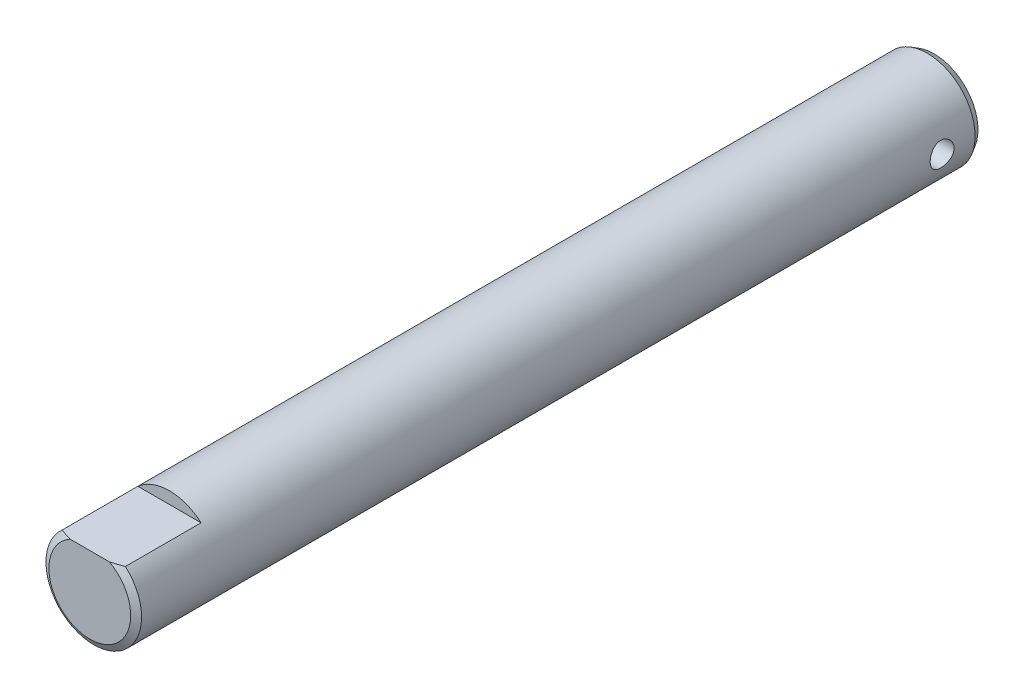
ISO-10303-21;
HEADER;
FILE_DESCRIPTION(('STEP AP214'),'2;1');
FILE_NAME('part.step','',(''),(''),'','','');
FILE_SCHEMA(('AUTOMOTIVE_DESIGN { 1 0 10303 214 1 1 1 1 }'));
ENDSEC;
DATA;
#1=APPLICATION_CONTEXT('core data for automotive mechanical design processes');
#2=APPLICATION_PROTOCOL_DEFINITION('international standard','automotive_design',2000,#1);
#3=PRODUCT_CONTEXT('',#1,'mechanical');
#4=PRODUCT('Part','Part','',(#3));
#5=PRODUCT_RELATED_PRODUCT_CATEGORY('part','',(#4));
#6=PRODUCT_DEFINITION_FORMATION('','',#4);
#7=PRODUCT_DEFINITION_CONTEXT('part definition',#1,'design');
#8=PRODUCT_DEFINITION('design','',#6,#7);
#9=PRODUCT_DEFINITION_SHAPE('','',#8);
#10=(LENGTH_UNIT() NAMED_UNIT(*) SI_UNIT(.MILLI.,.METRE.));
#11=(NAMED_UNIT(*) PLANE_ANGLE_UNIT() SI_UNIT($,.RADIAN.));
#12=(NAMED_UNIT(*) SI_UNIT($,.STERADIAN.) SOLID_ANGLE_UNIT());
#13=UNCERTAINTY_MEASURE_WITH_UNIT(LENGTH_MEASURE(1.E-05),#10,'distance_accuracy_value','');
#14=(GEOMETRIC_REPRESENTATION_CONTEXT(3) GLOBAL_UNCERTAINTY_ASSIGNED_CONTEXT((#13)) GLOBAL_UNIT_ASSIGNED_CONTEXT((#10,
#11,#12)) REPRESENTATION_CONTEXT('',''));
#15=CARTESIAN_POINT('',(0.,0.,0.));
#16=DIRECTION('',(0.,0.,1.));
#17=DIRECTION('',(1.,0.,0.));
#18=AXIS2_PLACEMENT_3D('',#15,#16,#17);
#19=CARTESIAN_POINT('',(0.,0.,106.));
#20=DIRECTION('',(0.,0.,-1.));
#21=DIRECTION('',(-1.,0.,0.));
#22=AXIS2_PLACEMENT_3D('',#19,#20,#21);
#23=CYLINDRICAL_SURFACE('',#22,6.);
#24=CARTESIAN_POINT('',(0.,0.,0.866025403784401));
#25=DIRECTION('',(0.,0.,1.));
#26=DIRECTION('',(1.,0.,0.));
#27=AXIS2_PLACEMENT_3D('',#24,#25,#26);
#28=CIRCLE('',#27,6.);
#29=CARTESIAN_POINT('',(6.,0.,0.866025403784401));
#30=VERTEX_POINT('',#29);
#31=EDGE_CURVE('E132',#30,#30,#28,.T.);
#32=ORIENTED_EDGE('',*,*,#31,.T.);
#33=EDGE_LOOP('',(#32));
#34=FACE_BOUND('',#33,.T.);
#35=CARTESIAN_POINT('',(-6.,0.,3.5));
#36=CARTESIAN_POINT('',(-5.99999859868013,0.0828760886697312,3.50000232573816));
#37=CARTESIAN_POINT('',(-5.99826578131828,0.165778157830763,3.50689155077379));
#38=CARTESIAN_POINT('',(-5.99152113829892,0.329206323770533,3.534225151307));
#39=CARTESIAN_POINT('',(-5.98650745419968,0.409731046870739,3.55467720953785));
#40=CARTESIAN_POINT('',(-5.9737562633204,0.566020872182577,3.60843925346209));
#41=CARTESIAN_POINT('',(-5.96602202842087,0.641791563430003,3.64173379871528));
#42=CARTESIAN_POINT('',(-5.94865343807593,0.786672131904427,3.72018139004483));
#43=CARTESIAN_POINT('',(-5.9390190185405,0.85578178434876,3.76533483611894));
#44=CARTESIAN_POINT('',(-5.91867413591801,0.98680192730092,3.86720078965421));
#45=CARTESIAN_POINT('',(-5.90794707148533,1.04855569006107,3.92411157495918));
#46=CARTESIAN_POINT('',(-5.8867362011753,1.1617489272033,4.04745220490892));
#47=CARTESIAN_POINT('',(-5.87625242288348,1.21318723694914,4.1138831229465));
#48=CARTESIAN_POINT('',(-5.8565477569971,1.30502654279903,4.25559522673744));
#49=CARTESIAN_POINT('',(-5.84734794470605,1.34525221592536,4.3309932308104));
#50=CARTESIAN_POINT('',(-5.83149494812223,1.41239690855053,4.48774841165836));
#51=CARTESIAN_POINT('',(-5.82484135672789,1.43931805543933,4.56910463332576));
#52=CARTESIAN_POINT('',(-5.81500476717551,1.47855483680429,4.73374349820248));
#53=CARTESIAN_POINT('',(-5.81175491075426,1.49115226833334,4.8169548960498));
#54=CARTESIAN_POINT('',(-5.80889362537741,1.50226177506785,4.98436856901398));
#55=CARTESIAN_POINT('',(-5.80928160448644,1.50077614181798,5.06857068069861));
#56=CARTESIAN_POINT('',(-5.81359205496618,1.48398652463928,5.23341580774448));
#57=CARTESIAN_POINT('',(-5.81742863001879,1.46901834019052,5.3140956214651));
#58=CARTESIAN_POINT('',(-5.82806709676484,1.42622418690311,5.47176105091129));
#59=CARTESIAN_POINT('',(-5.83486919970696,1.39839730206942,5.54874640302898));
#60=CARTESIAN_POINT('',(-5.85075113904187,1.33038947793715,5.69773801625207));
#61=CARTESIAN_POINT('',(-5.85985327469421,1.29008666723291,5.76968617178955));
#62=CARTESIAN_POINT('',(-5.87929710846386,1.19835627601496,5.90591870975684));
#63=CARTESIAN_POINT('',(-5.88963902334735,1.14692674880884,5.97020174806726));
#64=CARTESIAN_POINT('',(-5.91075880539781,1.03266342468122,6.0912036156944));
#65=CARTESIAN_POINT('',(-5.92154069477971,0.969546258165861,6.14765449006135));
#66=CARTESIAN_POINT('',(-5.94205965578786,0.834611917503701,6.24922124246391));
#67=CARTESIAN_POINT('',(-5.95179669549415,0.762794477707944,6.29433677426357));
#68=CARTESIAN_POINT('',(-5.96917732094183,0.612115888681392,6.37205058622439));
#69=CARTESIAN_POINT('',(-5.97681360127725,0.533231393208624,6.40460534025443));
#70=CARTESIAN_POINT('',(-5.98907916991419,0.370876008142884,6.45591730570957));
#71=CARTESIAN_POINT('',(-5.99370903339281,0.287405999150485,6.47467715641814));
#72=CARTESIAN_POINT('',(-5.99935499271375,0.120539970390027,6.49745756555884));
#73=CARTESIAN_POINT('',(-6.00046053508279,0.0371967199882102,6.5018430260753));
#74=CARTESIAN_POINT('',(-5.99918804814451,-0.129032874801508,6.49675099794452));
#75=CARTESIAN_POINT('',(-5.99681033241847,-0.211919259644595,6.48727475720087));
#76=CARTESIAN_POINT('',(-5.98889581127357,-0.373614268776492,6.45502909160862));
#77=CARTESIAN_POINT('',(-5.98340634185811,-0.452465118968754,6.43245873652301));
#78=CARTESIAN_POINT('',(-5.96988706634134,-0.605257292452511,6.37489291597156));
#79=CARTESIAN_POINT('',(-5.96185700369892,-0.679198119032634,6.33989619568683));
#80=CARTESIAN_POINT('',(-5.9439330792631,-0.821523134429847,6.25776387112527));
#81=CARTESIAN_POINT('',(-5.93400867366932,-0.88978544183583,6.21042388760324));
#82=CARTESIAN_POINT('',(-5.91344509187419,-1.01752661364325,6.10521009120303));
#83=CARTESIAN_POINT('',(-5.90280579251705,-1.07700395897301,6.04733446038309));
#84=CARTESIAN_POINT('',(-5.88168956960771,-1.18699056807273,5.92099803915554));
#85=CARTESIAN_POINT('',(-5.87122304187281,-1.23724386762203,5.85231229699758));
#86=CARTESIAN_POINT('',(-5.85192878377239,-1.3255107590127,5.70726736553428));
#87=CARTESIAN_POINT('',(-5.84310098067026,-1.36352489415794,5.63090851704025));
#88=CARTESIAN_POINT('',(-5.82818094734665,-1.42595142060929,5.47309427758692));
#89=CARTESIAN_POINT('',(-5.82207255291906,-1.45044439665407,5.39167237165599));
#90=CARTESIAN_POINT('',(-5.81326744090184,-1.48534565995378,5.22569036211089));
#91=CARTESIAN_POINT('',(-5.81056997719936,-1.49575702747866,5.14113094896751));
#92=CARTESIAN_POINT('',(-5.80894901203957,-1.50203859033399,4.9738789761448));
#93=CARTESIAN_POINT('',(-5.80991932728264,-1.49831789778012,4.89120256487527));
#94=CARTESIAN_POINT('',(-5.81527909007843,-1.47737727831287,4.72769611133202));
#95=CARTESIAN_POINT('',(-5.81966846891857,-1.46015762268677,4.64686603198635));
#96=CARTESIAN_POINT('',(-5.83131260682722,-1.41293131944279,4.48979154093459));
#97=CARTESIAN_POINT('',(-5.83855015236309,-1.38300140468038,4.41352269475979));
#98=CARTESIAN_POINT('',(-5.85507755724829,-1.31126491360507,4.26703461728631));
#99=CARTESIAN_POINT('',(-5.86436770120773,-1.26945669003419,4.19681622681309));
#100=CARTESIAN_POINT('',(-5.88425634263512,-1.17386774863714,4.06244537099798));
#101=CARTESIAN_POINT('',(-5.89488264831757,-1.11980316291226,3.99849892657604));
#102=CARTESIAN_POINT('',(-5.91608027246286,-1.00178937118974,3.88045295520459));
#103=CARTESIAN_POINT('',(-5.9266515772706,-0.937837821261146,3.82635576988703));
#104=CARTESIAN_POINT('',(-5.94677655647663,-0.800467586702591,3.72858869143539));
#105=CARTESIAN_POINT('',(-5.95630833365868,-0.726898422316387,3.68512538632842));
#106=CARTESIAN_POINT('',(-5.97304924975118,-0.573266059510477,3.61125253705947));
#107=CARTESIAN_POINT('',(-5.98026005199781,-0.49320756343674,3.58083363935146));
#108=CARTESIAN_POINT('',(-5.99048059565542,-0.344410253243473,3.53842816967035));
#109=CARTESIAN_POINT('',(-5.99402585052691,-0.27638017090807,3.52404875694657));
#110=CARTESIAN_POINT('',(-5.99878605231948,-0.138906071536284,3.50483405637806));
#111=CARTESIAN_POINT('',(-6.00000117450894,-0.0694621612426168,3.4999980506947));
#112=CARTESIAN_POINT('',(-6.,0.,3.5));
#113=B_SPLINE_CURVE_WITH_KNOTS('',3,(#35,#36,#37,#38,#39,#40,#41,#42,#43,#44,#45,#46,#47,#48,
#49,#50,#51,#52,#53,#54,#55,#56,#57,#58,#59,#60,#61,#62,#63,#64,#65,#66,#67,#68,#69,#70,#71,#72,
#73,#74,#75,#76,#77,#78,#79,#80,#81,#82,#83,#84,#85,#86,#87,#88,#89,#90,#91,#92,#93,#94,#95,#96,
#97,#98,#99,#100,#101,#102,#103,#104,#105,#106,#107,#108,#109,#110,#111,#112),.UNSPECIFIED.,.T.,
.F.,(4,2,2,2,2,2,2,2,2,2,2,2,2,2,2,2,2,2,2,2,2,2,2,2,2,2,2,2,2,2,2,2,2,2,2,2,2,2,4),(0.,
0.24837371247189,0.4968882377639,0.745104902286106,0.993329940169328,1.24614435437139,
1.49898729580062,1.75558647545807,2.01214461169368,2.2635629509943,2.51494038112697,
2.76022497007018,3.00552703466038,3.25330527873879,3.50112690836163,3.75601500969019,
4.01091089558247,4.26668229009114,4.52240473688643,4.77158308949276,5.02073901112743,
5.26620274514038,5.51169127322291,5.76153587565352,6.01142363008019,6.26744509204476,
6.52345518749508,6.77792254614037,7.03233423252408,7.27943780398613,7.52653640956035,
7.77216400559448,8.01782568136902,8.26989576409911,8.52202569770418,8.77872185499588,
9.03523363821351,9.24342242942149,9.4515955604304),.UNSPECIFIED.);
#114=CARTESIAN_POINT('',(-6.,0.,3.5));
#115=VERTEX_POINT('',#114);
#116=EDGE_CURVE('E98',#115,#115,#113,.T.);
#117=ORIENTED_EDGE('',*,*,#116,.T.);
#118=EDGE_LOOP('',(#117));
#119=FACE_BOUND('',#118,.T.);
#120=CARTESIAN_POINT('',(6.,0.,3.5));
#121=CARTESIAN_POINT('',(5.99999859868012,-0.0828760886697312,3.50000232573816));
#122=CARTESIAN_POINT('',(5.99826578131828,-0.165778157830763,3.50689155077379));
#123=CARTESIAN_POINT('',(5.99152113829892,-0.329206323770533,3.534225151307));
#124=CARTESIAN_POINT('',(5.98650745419968,-0.409731046870739,3.55467720953785));
#125=CARTESIAN_POINT('',(5.9737562633204,-0.566020872182577,3.60843925346209));
#126=CARTESIAN_POINT('',(5.96602202842087,-0.641791563430004,3.64173379871528));
#127=CARTESIAN_POINT('',(5.94865343807593,-0.786672131904427,3.72018139004483));
#128=CARTESIAN_POINT('',(5.9390190185405,-0.85578178434876,3.76533483611894));
#129=CARTESIAN_POINT('',(5.91867413591801,-0.98680192730092,3.86720078965421));
#130=CARTESIAN_POINT('',(5.90794707148533,-1.04855569006107,3.92411157495918));
#131=CARTESIAN_POINT('',(5.8867362011753,-1.16174892720331,4.04745220490892));
#132=CARTESIAN_POINT('',(5.87625242288348,-1.21318723694914,4.1138831229465));
#133=CARTESIAN_POINT('',(5.8565477569971,-1.30502654279903,4.25559522673744));
#134=CARTESIAN_POINT('',(5.84734794470605,-1.34525221592536,4.3309932308104));
#135=CARTESIAN_POINT('',(5.83149494812223,-1.41239690855053,4.48774841165836));
#136=CARTESIAN_POINT('',(5.82484135672789,-1.43931805543933,4.56910463332576));
#137=CARTESIAN_POINT('',(5.81500476717551,-1.47855483680429,4.73374349820248));
#138=CARTESIAN_POINT('',(5.81175491075426,-1.49115226833334,4.8169548960498));
#139=CARTESIAN_POINT('',(5.80889362537741,-1.50226177506785,4.98436856901398));
#140=CARTESIAN_POINT('',(5.80928160448644,-1.50077614181798,5.06857068069861));
#141=CARTESIAN_POINT('',(5.81359205496618,-1.48398652463928,5.23341580774448));
#142=CARTESIAN_POINT('',(5.81742863001879,-1.46901834019052,5.3140956214651));
#143=CARTESIAN_POINT('',(5.82806709676484,-1.42622418690311,5.47176105091129));
#144=CARTESIAN_POINT('',(5.83486919970696,-1.39839730206942,5.54874640302898));
#145=CARTESIAN_POINT('',(5.85075113904187,-1.33038947793715,5.69773801625207));
#146=CARTESIAN_POINT('',(5.85985327469421,-1.29008666723291,5.76968617178955));
#147=CARTESIAN_POINT('',(5.87929710846386,-1.19835627601496,5.90591870975684));
#148=CARTESIAN_POINT('',(5.88963902334735,-1.14692674880884,5.97020174806726));
#149=CARTESIAN_POINT('',(5.91075880539781,-1.03266342468122,6.0912036156944));
#150=CARTESIAN_POINT('',(5.92154069477971,-0.969546258165861,6.14765449006135));
#151=CARTESIAN_POINT('',(5.94205965578786,-0.834611917503701,6.24922124246391));
#152=CARTESIAN_POINT('',(5.95179669549415,-0.762794477707945,6.29433677426357));
#153=CARTESIAN_POINT('',(5.96917732094183,-0.612115888681392,6.37205058622439));
#154=CARTESIAN_POINT('',(5.97681360127725,-0.533231393208624,6.40460534025443));
#155=CARTESIAN_POINT('',(5.98907916991419,-0.370876008142883,6.45591730570957));
#156=CARTESIAN_POINT('',(5.99370903339281,-0.287405999150485,6.47467715641814));
#157=CARTESIAN_POINT('',(5.99935499271375,-0.120539970390027,6.49745756555884));
#158=CARTESIAN_POINT('',(6.00046053508279,-0.0371967199882101,6.5018430260753));
#159=CARTESIAN_POINT('',(5.99918804814451,0.129032874801508,6.49675099794452));
#160=CARTESIAN_POINT('',(5.99681033241847,0.211919259644595,6.48727475720087));
#161=CARTESIAN_POINT('',(5.98889581127357,0.373614268776492,6.45502909160862));
#162=CARTESIAN_POINT('',(5.98340634185811,0.452465118968755,6.43245873652301));
#163=CARTESIAN_POINT('',(5.96988706634134,0.605257292452512,6.37489291597155));
#164=CARTESIAN_POINT('',(5.96185700369892,0.679198119032635,6.33989619568683));
#165=CARTESIAN_POINT('',(5.94393307926311,0.821523134429848,6.25776387112527));
#166=CARTESIAN_POINT('',(5.93400867366932,0.889785441835831,6.21042388760324));
#167=CARTESIAN_POINT('',(5.91344509187419,1.01752661364325,6.10521009120303));
#168=CARTESIAN_POINT('',(5.90280579251705,1.07700395897301,6.04733446038309));
#169=CARTESIAN_POINT('',(5.88168956960771,1.18699056807273,5.92099803915554));
#170=CARTESIAN_POINT('',(5.87122304187281,1.23724386762203,5.85231229699758));
#171=CARTESIAN_POINT('',(5.85192878377239,1.3255107590127,5.70726736553428));
#172=CARTESIAN_POINT('',(5.84310098067026,1.36352489415794,5.63090851704025));
#173=CARTESIAN_POINT('',(5.82818094734665,1.42595142060929,5.47309427758692));
#174=CARTESIAN_POINT('',(5.82207255291906,1.45044439665407,5.39167237165599));
#175=CARTESIAN_POINT('',(5.81326744090184,1.48534565995378,5.22569036211089));
#176=CARTESIAN_POINT('',(5.81056997719936,1.49575702747866,5.14113094896751));
#177=CARTESIAN_POINT('',(5.80894901203957,1.50203859033399,4.9738789761448));
#178=CARTESIAN_POINT('',(5.80991932728264,1.49831789778012,4.89120256487527));
#179=CARTESIAN_POINT('',(5.81527909007843,1.47737727831287,4.72769611133202));
#180=CARTESIAN_POINT('',(5.81966846891857,1.46015762268677,4.64686603198635));
#181=CARTESIAN_POINT('',(5.83131260682722,1.41293131944279,4.48979154093459));
#182=CARTESIAN_POINT('',(5.83855015236309,1.38300140468038,4.41352269475979));
#183=CARTESIAN_POINT('',(5.85507755724829,1.31126491360507,4.26703461728631));
#184=CARTESIAN_POINT('',(5.86436770120773,1.26945669003419,4.19681622681309));
#185=CARTESIAN_POINT('',(5.88425634263512,1.17386774863714,4.06244537099798));
#186=CARTESIAN_POINT('',(5.89488264831757,1.11980316291226,3.99849892657604));
#187=CARTESIAN_POINT('',(5.91608027246286,1.00178937118974,3.88045295520459));
#188=CARTESIAN_POINT('',(5.9266515772706,0.937837821261146,3.82635576988703));
#189=CARTESIAN_POINT('',(5.94677655647663,0.800467586702591,3.72858869143539));
#190=CARTESIAN_POINT('',(5.95630833365868,0.726898422316387,3.68512538632842));
#191=CARTESIAN_POINT('',(5.97304924975118,0.573266059510477,3.61125253705947));
#192=CARTESIAN_POINT('',(5.98026005199781,0.49320756343674,3.58083363935146));
#193=CARTESIAN_POINT('',(5.99048059565542,0.344410253243472,3.53842816967035));
#194=CARTESIAN_POINT('',(5.99402585052691,0.276380170908069,3.52404875694657));
#195=CARTESIAN_POINT('',(5.99878605231948,0.138906071536284,3.50483405637806));
#196=CARTESIAN_POINT('',(6.00000117450894,0.0694621612426165,3.4999980506947));
#197=CARTESIAN_POINT('',(6.,0.,3.5));
#198=B_SPLINE_CURVE_WITH_KNOTS('',3,(#120,#121,#122,#123,#124,#125,#126,#127,#128,#129,#130,
#131,#132,#133,#134,#135,#136,#137,#138,#139,#140,#141,#142,#143,#144,#145,#146,#147,#148,#149,
#150,#151,#152,#153,#154,#155,#156,#157,#158,#159,#160,#161,#162,#163,#164,#165,#166,#167,#168,
#169,#170,#171,#172,#173,#174,#175,#176,#177,#178,#179,#180,#181,#182,#183,#184,#185,#186,#187,
#188,#189,#190,#191,#192,#193,#194,#195,#196,#197),.UNSPECIFIED.,.T.,.F.,(4,2,2,2,2,2,2,2,2,2,2,
2,2,2,2,2,2,2,2,2,2,2,2,2,2,2,2,2,2,2,2,2,2,2,2,2,2,2,4),(0.,0.24837371247189,0.4968882377639,
0.745104902286106,0.993329940169329,1.24614435437139,1.49898729580062,1.75558647545807,
2.01214461169369,2.2635629509943,2.51494038112697,2.76022497007018,3.00552703466038,
3.25330527873879,3.50112690836163,3.75601500969019,4.01091089558247,4.26668229009114,
4.52240473688643,4.77158308949276,5.02073901112743,5.26620274514037,5.51169127322291,
5.76153587565352,6.01142363008019,6.26744509204476,6.52345518749508,6.77792254614037,
7.03233423252408,7.27943780398613,7.52653640956034,7.77216400559447,8.01782568136901,
8.2698957640991,8.52202569770418,8.77872185499588,9.0352336382135,9.24342242942149,
9.4515955604304),.UNSPECIFIED.);
#199=CARTESIAN_POINT('',(6.,0.,3.5));
#200=VERTEX_POINT('',#199);
#201=EDGE_CURVE('E84',#200,#200,#198,.T.);
#202=ORIENTED_EDGE('',*,*,#201,.T.);
#203=EDGE_LOOP('',(#202));
#204=FACE_BOUND('',#203,.T.);
#205=DIRECTION('',(0.,0.,-1.));
#206=VECTOR('',#205,1.);
#207=CARTESIAN_POINT('',(3.96862696659689,4.5,106.));
#208=LINE('',#207,#206);
#209=CARTESIAN_POINT('',(3.96862696659689,4.5,96.));
#210=VERTEX_POINT('',#209);
#211=CARTESIAN_POINT('',(3.96862696659689,4.5,105.5));
#212=VERTEX_POINT('',#211);
#213=EDGE_CURVE('E78',#210,#212,#208,.F.);
#214=ORIENTED_EDGE('',*,*,#213,.T.);
#215=CARTESIAN_POINT('',(0.,0.,105.5));
#216=DIRECTION('',(0.,0.,1.));
#217=DIRECTION('',(1.,0.,0.));
#218=AXIS2_PLACEMENT_3D('',#215,#216,#217);
#219=CIRCLE('',#218,6.);
#220=CARTESIAN_POINT('',(-3.96862696659689,4.5,105.5));
#221=VERTEX_POINT('',#220);
#222=EDGE_CURVE('E48',#212,#221,#219,.F.);
#223=ORIENTED_EDGE('',*,*,#222,.T.);
#224=DIRECTION('',(0.,0.,-1.));
#225=VECTOR('',#224,1.);
#226=CARTESIAN_POINT('',(-3.96862696659689,4.5,106.));
#227=LINE('',#226,#225);
#228=CARTESIAN_POINT('',(-3.96862696659689,4.5,96.));
#229=VERTEX_POINT('',#228);
#230=EDGE_CURVE('E72',#221,#229,#227,.T.);
#231=ORIENTED_EDGE('',*,*,#230,.T.);
#232=CARTESIAN_POINT('',(0.,0.,96.));
#233=DIRECTION('',(0.,0.,1.));
#234=DIRECTION('',(1.,0.,0.));
#235=AXIS2_PLACEMENT_3D('',#232,#233,#234);
#236=CIRCLE('',#235,6.);
#237=EDGE_CURVE('E74',#210,#229,#236,.T.);
#238=ORIENTED_EDGE('',*,*,#237,.F.);
#239=EDGE_LOOP('',(#214,#223,#231,#238));
#240=FACE_BOUND('',#239,.T.);
#241=ADVANCED_FACE('F39',(#34,#119,#204,#240),#23,.T.);
#242=CARTESIAN_POINT('',(0.,0.,106.));
#243=DIRECTION('',(0.,0.,1.));
#244=DIRECTION('',(1.,0.,0.));
#245=AXIS2_PLACEMENT_3D('',#242,#243,#244);
#246=PLANE('',#245);
#247=DIRECTION('',(1.,0.,0.));
#248=VECTOR('',#247,1.);
#249=CARTESIAN_POINT('',(0.,4.5,106.));
#250=LINE('',#249,#248);
#251=CARTESIAN_POINT('',(-2.47137515456208,4.5,106.));
#252=VERTEX_POINT('',#251);
#253=CARTESIAN_POINT('',(2.47137515456208,4.5,106.));
#254=VERTEX_POINT('',#253);
#255=EDGE_CURVE('E77',#252,#254,#250,.T.);
#256=ORIENTED_EDGE('',*,*,#255,.F.);
#257=CARTESIAN_POINT('',(0.,0.,106.));
#258=DIRECTION('',(0.,0.,1.));
#259=DIRECTION('',(1.,0.,0.));
#260=AXIS2_PLACEMENT_3D('',#257,#258,#259);
#261=CIRCLE('',#260,5.13397459621556);
#262=EDGE_CURVE('E158',#252,#254,#261,.T.);
#263=ORIENTED_EDGE('',*,*,#262,.T.);
#264=EDGE_LOOP('',(#256,#263));
#265=FACE_BOUND('',#264,.T.);
#266=ADVANCED_FACE('F118',(#265),#246,.T.);
#267=CARTESIAN_POINT('',(0.,0.,0.));
#268=DIRECTION('',(0.,0.,1.));
#269=DIRECTION('',(1.,0.,0.));
#270=AXIS2_PLACEMENT_3D('',#267,#268,#269);
#271=PLANE('',#270);
#272=CARTESIAN_POINT('',(0.,0.,0.));
#273=DIRECTION('',(0.,0.,1.));
#274=DIRECTION('',(1.,0.,0.));
#275=AXIS2_PLACEMENT_3D('',#272,#273,#274);
#276=CIRCLE('',#275,5.50000000000003);
#277=CARTESIAN_POINT('',(5.50000000000003,0.,0.));
#278=VERTEX_POINT('',#277);
#279=EDGE_CURVE('E11',#278,#278,#276,.F.);
#280=ORIENTED_EDGE('',*,*,#279,.T.);
#281=EDGE_LOOP('',(#280));
#282=FACE_BOUND('',#281,.T.);
#283=ADVANCED_FACE('F114',(#282),#271,.F.);
#284=CARTESIAN_POINT('',(0.,0.,96.));
#285=DIRECTION('',(0.,0.,1.));
#286=DIRECTION('',(1.,0.,0.));
#287=AXIS2_PLACEMENT_3D('',#284,#285,#286);
#288=PLANE('',#287);
#289=ORIENTED_EDGE('',*,*,#237,.T.);
#290=DIRECTION('',(1.,0.,0.));
#291=VECTOR('',#290,1.);
#292=CARTESIAN_POINT('',(-6.44874547961821,4.5,96.));
#293=LINE('',#292,#291);
#294=EDGE_CURVE('E83',#229,#210,#293,.T.);
#295=ORIENTED_EDGE('',*,*,#294,.T.);
#296=EDGE_LOOP('',(#289,#295));
#297=FACE_BOUND('',#296,.T.);
#298=ADVANCED_FACE('F82',(#297),#288,.T.);
#299=CARTESIAN_POINT('',(-6.44874547961821,4.5,96.));
#300=DIRECTION('',(0.,-1.,0.));
#301=DIRECTION('',(0.,0.,-1.));
#302=AXIS2_PLACEMENT_3D('',#299,#300,#301);
#303=PLANE('',#302);
#304=ORIENTED_EDGE('',*,*,#255,.T.);
#305=CARTESIAN_POINT('',(2.47137515456208,4.5,106.));
#306=CARTESIAN_POINT('',(2.59821029234091,4.5,105.964741067028));
#307=CARTESIAN_POINT('',(2.72449842776643,4.5,105.927566203446));
#308=CARTESIAN_POINT('',(2.97597185015973,4.5,105.849882020878));
#309=CARTESIAN_POINT('',(3.10115769990573,4.5,105.809374527543));
#310=CARTESIAN_POINT('',(3.35054029678143,4.5,105.725488234176));
#311=CARTESIAN_POINT('',(3.47473716361617,4.5,105.682109787745));
#312=CARTESIAN_POINT('',(3.72230196848673,4.5,105.592839293428));
#313=CARTESIAN_POINT('',(3.84566941885811,4.5,105.54694589105));
#314=CARTESIAN_POINT('',(3.96862696659689,4.5,105.5));
#315=B_SPLINE_CURVE_WITH_KNOTS('',3,(#305,#306,#307,#308,#309,#310,#311,#312,#313,#314),
.UNSPECIFIED.,.F.,.F.,(4,2,2,2,4),(0.,0.394899349737702,0.789583791657925,1.18421971236831,
1.57907030390004),.UNSPECIFIED.);
#316=EDGE_CURVE('E62',#254,#212,#315,.T.);
#317=ORIENTED_EDGE('',*,*,#316,.T.);
#318=ORIENTED_EDGE('',*,*,#213,.F.);
#319=ORIENTED_EDGE('',*,*,#294,.F.);
#320=ORIENTED_EDGE('',*,*,#230,.F.);
#321=CARTESIAN_POINT('',(-3.96862696659689,4.5,105.5));
#322=CARTESIAN_POINT('',(-3.84566941885811,4.5,105.54694589105));
#323=CARTESIAN_POINT('',(-3.72230196848673,4.5,105.592839293428));
#324=CARTESIAN_POINT('',(-3.47473716361617,4.5,105.682109787745));
#325=CARTESIAN_POINT('',(-3.35054029678143,4.5,105.725488234176));
#326=CARTESIAN_POINT('',(-3.10115769990573,4.5,105.809374527543));
#327=CARTESIAN_POINT('',(-2.97597185015973,4.5,105.849882020878));
#328=CARTESIAN_POINT('',(-2.72449842776643,4.5,105.927566203446));
#329=CARTESIAN_POINT('',(-2.59821029234091,4.5,105.964741067028));
#330=CARTESIAN_POINT('',(-2.47137515456208,4.5,106.));
#331=B_SPLINE_CURVE_WITH_KNOTS('',3,(#321,#322,#323,#324,#325,#326,#327,#328,#329,#330),
.UNSPECIFIED.,.F.,.F.,(4,2,2,2,4),(0.,0.394850591531729,0.789486512242111,1.18417095416234,
1.57907030390004),.UNSPECIFIED.);
#332=EDGE_CURVE('E121',#221,#252,#331,.T.);
#333=ORIENTED_EDGE('',*,*,#332,.T.);
#334=EDGE_LOOP('',(#304,#317,#318,#319,#320,#333));
#335=FACE_BOUND('',#334,.T.);
#336=ADVANCED_FACE('F86',(#335),#303,.F.);
#337=CARTESIAN_POINT('',(-6.,0.,5.));
#338=DIRECTION('',(1.,0.,0.));
#339=DIRECTION('',(0.,0.,-1.));
#340=AXIS2_PLACEMENT_3D('',#337,#338,#339);
#341=CYLINDRICAL_SURFACE('',#340,1.5);
#342=ORIENTED_EDGE('',*,*,#201,.F.);
#343=EDGE_LOOP('',(#342));
#344=FACE_BOUND('',#343,.T.);
#345=ORIENTED_EDGE('',*,*,#116,.F.);
#346=EDGE_LOOP('',(#345));
#347=FACE_BOUND('',#346,.T.);
#348=ADVANCED_FACE('F105',(#344,#347),#341,.F.);
#349=CARTESIAN_POINT('',(0.,0.,106.));
#350=DIRECTION('',(0.,0.,-1.));
#351=DIRECTION('',(-1.,0.,0.));
#352=AXIS2_PLACEMENT_3D('',#349,#350,#351);
#353=CONICAL_SURFACE('',#352,5.13397459621556,1.04719755119659);
#354=ORIENTED_EDGE('',*,*,#332,.F.);
#355=ORIENTED_EDGE('',*,*,#222,.F.);
#356=ORIENTED_EDGE('',*,*,#316,.F.);
#357=ORIENTED_EDGE('',*,*,#262,.F.);
#358=EDGE_LOOP('',(#354,#355,#356,#357));
#359=FACE_BOUND('',#358,.T.);
#360=ADVANCED_FACE('F109',(#359),#353,.T.);
#361=CARTESIAN_POINT('',(0.,0.,0.866025403784401));
#362=DIRECTION('',(0.,0.,1.));
#363=DIRECTION('',(1.,0.,0.));
#364=AXIS2_PLACEMENT_3D('',#361,#362,#363);
#365=CONICAL_SURFACE('',#364,6.,0.523598775598296);
#366=CARTESIAN_POINT('',(5.50000000000003,0.,0.));
#367=CARTESIAN_POINT('',(5.50520833333336,0.,0.00902109795608741));
#368=CARTESIAN_POINT('',(5.51041666666669,0.,0.0180421959121749));
#369=CARTESIAN_POINT('',(5.52083333333336,0.,0.0360843918243499));
#370=CARTESIAN_POINT('',(5.52604166666669,0.,0.0451054897804374));
#371=CARTESIAN_POINT('',(5.53645833333336,0.,0.0631476856926125));
#372=CARTESIAN_POINT('',(5.54166666666669,0.,0.0721687836487));
#373=CARTESIAN_POINT('',(5.55208333333336,0.,0.090210979560875));
#374=CARTESIAN_POINT('',(5.55729166666669,0.,0.0992320775169625));
#375=CARTESIAN_POINT('',(5.56770833333336,0.,0.117274273429138));
#376=CARTESIAN_POINT('',(5.57291666666669,0.,0.126295371385225));
#377=CARTESIAN_POINT('',(5.58333333333335,0.,0.1443375672974));
#378=CARTESIAN_POINT('',(5.58854166666669,0.,0.153358665253488));
#379=CARTESIAN_POINT('',(5.59895833333335,0.,0.171400861165663));
#380=CARTESIAN_POINT('',(5.60416666666669,0.,0.18042195912175));
#381=CARTESIAN_POINT('',(5.61458333333335,0.,0.198464155033925));
#382=CARTESIAN_POINT('',(5.61979166666669,0.,0.207485252990013));
#383=CARTESIAN_POINT('',(5.63020833333335,0.,0.225527448902188));
#384=CARTESIAN_POINT('',(5.63541666666669,0.,0.234548546858275));
#385=CARTESIAN_POINT('',(5.64583333333335,0.,0.25259074277045));
#386=CARTESIAN_POINT('',(5.65104166666669,0.,0.261611840726538));
#387=CARTESIAN_POINT('',(5.66145833333335,0.,0.279654036638713));
#388=CARTESIAN_POINT('',(5.66666666666668,0.,0.2886751345948));
#389=CARTESIAN_POINT('',(5.67708333333335,0.,0.306717330506975));
#390=CARTESIAN_POINT('',(5.68229166666668,0.,0.315738428463063));
#391=CARTESIAN_POINT('',(5.69270833333335,0.,0.333780624375238));
#392=CARTESIAN_POINT('',(5.69791666666668,0.,0.342801722331325));
#393=CARTESIAN_POINT('',(5.70833333333335,0.,0.3608439182435));
#394=CARTESIAN_POINT('',(5.71354166666668,0.,0.369865016199588));
#395=CARTESIAN_POINT('',(5.72395833333335,0.,0.387907212111763));
#396=CARTESIAN_POINT('',(5.72916666666668,0.,0.39692831006785));
#397=CARTESIAN_POINT('',(5.73958333333335,0.,0.414970505980026));
#398=CARTESIAN_POINT('',(5.74479166666668,0.,0.423991603936113));
#399=CARTESIAN_POINT('',(5.75520833333335,0.,0.442033799848288));
#400=CARTESIAN_POINT('',(5.76041666666668,0.,0.451054897804375));
#401=CARTESIAN_POINT('',(5.77083333333335,0.,0.469097093716551));
#402=CARTESIAN_POINT('',(5.77604166666668,0.,0.478118191672638));
#403=CARTESIAN_POINT('',(5.78645833333334,0.,0.496160387584813));
#404=CARTESIAN_POINT('',(5.79166666666668,0.,0.505181485540901));
#405=CARTESIAN_POINT('',(5.80208333333334,0.,0.523223681453076));
#406=CARTESIAN_POINT('',(5.80729166666668,0.,0.532244779409163));
#407=CARTESIAN_POINT('',(5.81770833333334,0.,0.550286975321338));
#408=CARTESIAN_POINT('',(5.82291666666668,0.,0.559308073277426));
#409=CARTESIAN_POINT('',(5.83333333333334,0.,0.577350269189601));
#410=CARTESIAN_POINT('',(5.83854166666668,0.,0.586371367145688));
#411=CARTESIAN_POINT('',(5.84895833333334,0.,0.604413563057863));
#412=CARTESIAN_POINT('',(5.85416666666667,0.,0.613434661013951));
#413=CARTESIAN_POINT('',(5.86458333333334,0.,0.631476856926126));
#414=CARTESIAN_POINT('',(5.86979166666667,0.,0.640497954882213));
#415=CARTESIAN_POINT('',(5.88020833333334,0.,0.658540150794388));
#416=CARTESIAN_POINT('',(5.88541666666667,0.,0.667561248750476));
#417=CARTESIAN_POINT('',(5.89583333333334,0.,0.685603444662651));
#418=CARTESIAN_POINT('',(5.90104166666667,0.,0.694624542618739));
#419=CARTESIAN_POINT('',(5.91145833333334,0.,0.712666738530914));
#420=CARTESIAN_POINT('',(5.91666666666667,0.,0.721687836487001));
#421=CARTESIAN_POINT('',(5.92708333333334,0.,0.739730032399176));
#422=CARTESIAN_POINT('',(5.93229166666667,0.,0.748751130355263));
#423=CARTESIAN_POINT('',(5.94270833333334,0.,0.766793326267439));
#424=CARTESIAN_POINT('',(5.94791666666667,0.,0.775814424223526));
#425=CARTESIAN_POINT('',(5.95833333333334,0.,0.793856620135701));
#426=CARTESIAN_POINT('',(5.96354166666667,0.,0.802877718091789));
#427=CARTESIAN_POINT('',(5.97395833333334,0.,0.820919914003964));
#428=CARTESIAN_POINT('',(5.97916666666667,0.,0.829941011960051));
#429=CARTESIAN_POINT('',(5.98958333333333,0.,0.847983207872226));
#430=CARTESIAN_POINT('',(5.99479166666667,0.,0.857004305828314));
#431=CARTESIAN_POINT('',(6.,0.,0.866025403784401));
#432=B_SPLINE_CURVE_WITH_KNOTS('',3,(#366,#367,#368,#369,#370,#371,#372,#373,#374,#375,#376,
#377,#378,#379,#380,#381,#382,#383,#384,#385,#386,#387,#388,#389,#390,#391,#392,#393,#394,#395,
#396,#397,#398,#399,#400,#401,#402,#403,#404,#405,#406,#407,#408,#409,#410,#411,#412,#413,#414,
#415,#416,#417,#418,#419,#420,#421,#422,#423,#424,#425,#426,#427,#428,#429,#430,#431),
.UNSPECIFIED.,.F.,.F.,(4,2,2,2,2,2,2,2,2,2,2,2,2,2,2,2,2,2,2,2,2,2,2,2,2,2,2,2,2,2,2,2,4),(0.,
0.0312499999999986,0.0624999999999971,0.0937499999999957,0.124999999999994,0.156249999999993,
0.187499999999991,0.21874999999999,0.249999999999989,0.281249999999987,0.312499999999986,
0.343749999999985,0.374999999999983,0.406249999999982,0.43749999999998,0.468749999999979,
0.499999999999977,0.531249999999976,0.562499999999975,0.593749999999974,0.624999999999972,
0.656249999999971,0.687499999999969,0.718749999999968,0.749999999999966,0.781249999999965,
0.812499999999963,0.843749999999962,0.874999999999961,0.906249999999959,0.937499999999958,
0.968749999999956,0.999999999999955),.UNSPECIFIED.);
#433=EDGE_CURVE('BSEAM42',#278,#30,#432,.T.);
#434=ORIENTED_EDGE('',*,*,#279,.F.);
#435=ORIENTED_EDGE('',*,*,#31,.F.);
#436=ORIENTED_EDGE('',*,*,#433,.T.);
#437=ORIENTED_EDGE('',*,*,#433,.F.);
#438=EDGE_LOOP('',(#434,#436,#435,#437));
#439=FACE_BOUND('',#438,.T.);
#440=ADVANCED_FACE('F42',(#439),#365,.T.);
#441=CLOSED_SHELL('',(#241,#266,#283,#298,#336,#348,#360,#440));
#442=MANIFOLD_SOLID_BREP('B2',#441);
#443=ADVANCED_BREP_SHAPE_REPRESENTATION('',(#18,#442),#14);
#444=SHAPE_DEFINITION_REPRESENTATION(#9,#443);
ENDSEC;
END-ISO-10303-21;
